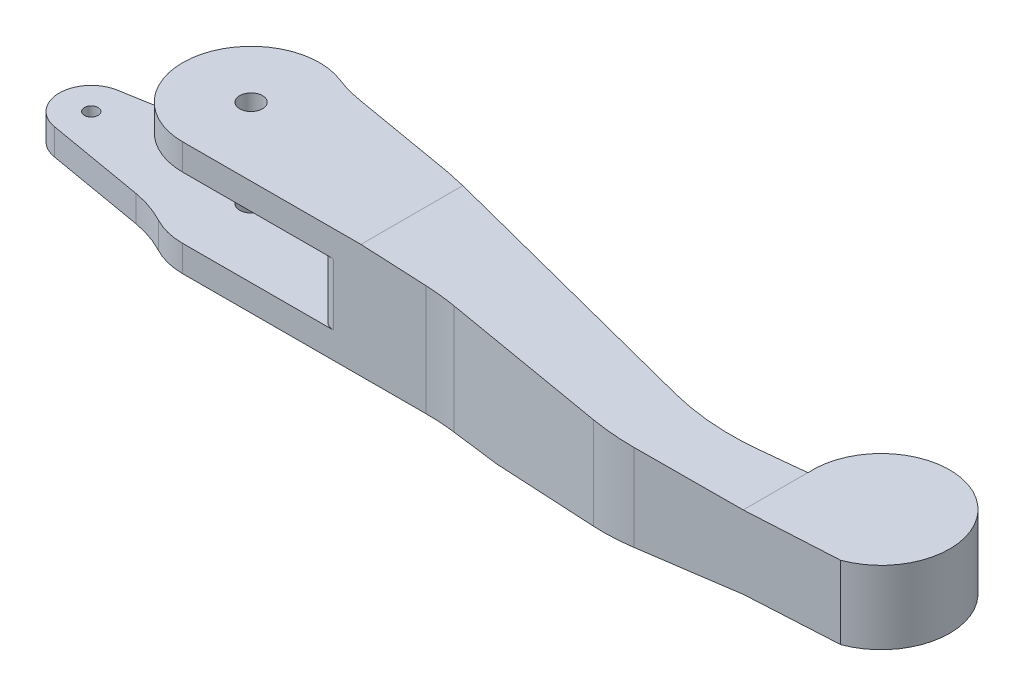
ISO-10303-21;
HEADER;
FILE_DESCRIPTION(('STEP AP214'),'2;1');
FILE_NAME('part.step','',(''),(''),'','','');
FILE_SCHEMA(('AUTOMOTIVE_DESIGN { 1 0 10303 214 1 1 1 1 }'));
ENDSEC;
DATA;
#1=APPLICATION_CONTEXT('core data for automotive mechanical design processes');
#2=APPLICATION_PROTOCOL_DEFINITION('international standard','automotive_design',2000,#1);
#3=PRODUCT_CONTEXT('',#1,'mechanical');
#4=PRODUCT('Part','Part','',(#3));
#5=PRODUCT_RELATED_PRODUCT_CATEGORY('part','',(#4));
#6=PRODUCT_DEFINITION_FORMATION('','',#4);
#7=PRODUCT_DEFINITION_CONTEXT('part definition',#1,'design');
#8=PRODUCT_DEFINITION('design','',#6,#7);
#9=PRODUCT_DEFINITION_SHAPE('','',#8);
#10=(LENGTH_UNIT() NAMED_UNIT(*) SI_UNIT(.MILLI.,.METRE.));
#11=(NAMED_UNIT(*) PLANE_ANGLE_UNIT() SI_UNIT($,.RADIAN.));
#12=(NAMED_UNIT(*) SI_UNIT($,.STERADIAN.) SOLID_ANGLE_UNIT());
#13=UNCERTAINTY_MEASURE_WITH_UNIT(LENGTH_MEASURE(1.E-05),#10,'distance_accuracy_value','');
#14=(GEOMETRIC_REPRESENTATION_CONTEXT(3) GLOBAL_UNCERTAINTY_ASSIGNED_CONTEXT((#13)) GLOBAL_UNIT_ASSIGNED_CONTEXT((#10,
#11,#12)) REPRESENTATION_CONTEXT('',''));
#15=CARTESIAN_POINT('',(0.,0.,0.));
#16=DIRECTION('',(0.,0.,1.));
#17=DIRECTION('',(1.,0.,0.));
#18=AXIS2_PLACEMENT_3D('',#15,#16,#17);
#19=CARTESIAN_POINT('',(0.,12.5,0.));
#20=DIRECTION('',(0.,-1.,0.));
#21=DIRECTION('',(0.,0.,-1.));
#22=AXIS2_PLACEMENT_3D('',#19,#20,#21);
#23=CYLINDRICAL_SURFACE('',#22,15.);
#24=CARTESIAN_POINT('',(0.,-12.5,0.));
#25=DIRECTION('',(0.,1.,0.));
#26=DIRECTION('',(0.,0.,1.));
#27=AXIS2_PLACEMENT_3D('',#24,#25,#26);
#28=CIRCLE('',#27,15.);
#29=CARTESIAN_POINT('',(5.47775067742488,-12.5,-13.9640340702811));
#30=VERTEX_POINT('',#29);
#31=CARTESIAN_POINT('',(-7.07384101472095,-12.5,-13.2272738422719));
#32=VERTEX_POINT('',#31);
#33=EDGE_CURVE('E395',#30,#32,#28,.T.);
#34=ORIENTED_EDGE('',*,*,#33,.T.);
#35=DIRECTION('',(0.,-1.,0.));
#36=VECTOR('',#35,1.);
#37=CARTESIAN_POINT('',(-7.07384101472095,12.5,-13.2272738422719));
#38=LINE('',#37,#36);
#39=CARTESIAN_POINT('',(-7.07384101472095,-6.75,-13.2272738422719));
#40=VERTEX_POINT('',#39);
#41=EDGE_CURVE('E53',#32,#40,#38,.F.);
#42=ORIENTED_EDGE('',*,*,#41,.T.);
#43=CARTESIAN_POINT('',(0.,-6.75,0.));
#44=DIRECTION('',(0.,1.,0.));
#45=DIRECTION('',(0.,0.,1.));
#46=AXIS2_PLACEMENT_3D('',#43,#44,#45);
#47=CIRCLE('',#46,15.);
#48=CARTESIAN_POINT('',(5.47775067742488,-6.75,-13.9640340702811));
#49=VERTEX_POINT('',#48);
#50=EDGE_CURVE('E287',#40,#49,#47,.F.);
#51=ORIENTED_EDGE('',*,*,#50,.T.);
#52=DIRECTION('',(0.,-1.,0.));
#53=VECTOR('',#52,1.);
#54=CARTESIAN_POINT('',(5.47775067742488,12.5,-13.9640340702811));
#55=LINE('',#54,#53);
#56=EDGE_CURVE('E443',#49,#30,#55,.T.);
#57=ORIENTED_EDGE('',*,*,#56,.T.);
#58=EDGE_LOOP('',(#34,#42,#51,#57));
#59=FACE_BOUND('',#58,.T.);
#60=ADVANCED_FACE('F32',(#59),#23,.T.);
#61=CARTESIAN_POINT('',(0.0257638334711041,-6.75,14.9999778741465));
#62=VERTEX_POINT('',#61);
#63=CARTESIAN_POINT('',(-7.07384101472095,-6.75,13.2272738422719));
#64=VERTEX_POINT('',#63);
#65=EDGE_CURVE('E288',#62,#64,#47,.F.);
#66=ORIENTED_EDGE('',*,*,#65,.T.);
#67=DIRECTION('',(0.,-1.,0.));
#68=VECTOR('',#67,1.);
#69=CARTESIAN_POINT('',(-7.07384101472095,12.5,13.2272738422719));
#70=LINE('',#69,#68);
#71=CARTESIAN_POINT('',(-7.07384101472095,-12.5,13.2272738422719));
#72=VERTEX_POINT('',#71);
#73=EDGE_CURVE('E476',#64,#72,#70,.T.);
#74=ORIENTED_EDGE('',*,*,#73,.T.);
#75=CARTESIAN_POINT('',(0.0257638334711041,-12.5,14.9999778741465));
#76=VERTEX_POINT('',#75);
#77=EDGE_CURVE('E378',#72,#76,#28,.T.);
#78=ORIENTED_EDGE('',*,*,#77,.T.);
#79=DIRECTION('',(0.,-1.,0.));
#80=VECTOR('',#79,1.);
#81=CARTESIAN_POINT('',(0.0257638334711041,12.5,14.9999778741465));
#82=LINE('',#81,#80);
#83=EDGE_CURVE('E439',#62,#76,#82,.T.);
#84=ORIENTED_EDGE('',*,*,#83,.F.);
#85=EDGE_LOOP('',(#66,#74,#78,#84));
#86=FACE_BOUND('',#85,.T.);
#87=ADVANCED_FACE('F491',(#86),#23,.T.);
#88=CARTESIAN_POINT('',(0.0257638334711041,12.5,14.9999778741465));
#89=DIRECTION('',(-0.00171758889807358,0.,-0.999998524943101));
#90=DIRECTION('',(-0.999998524943101,0.,0.00171758889807358));
#91=AXIS2_PLACEMENT_3D('',#88,#89,#90);
#92=PLANE('',#91);
#93=DIRECTION('',(0.,-1.,0.));
#94=VECTOR('',#93,1.);
#95=CARTESIAN_POINT('',(33.0051527666942,-6.74999999999999,14.9433327582948));
#96=LINE('',#95,#94);
#97=CARTESIAN_POINT('',(33.0051527666942,6.75,14.9433327582948));
#98=VERTEX_POINT('',#97);
#99=CARTESIAN_POINT('',(33.0051527666942,-6.75,14.9433327582948));
#100=VERTEX_POINT('',#99);
#101=EDGE_CURVE('E455',#98,#100,#96,.T.);
#102=ORIENTED_EDGE('',*,*,#101,.T.);
#103=DIRECTION('',(-0.999998524943101,0.,0.00171758889807358));
#104=VECTOR('',#103,1.);
#105=CARTESIAN_POINT('',(-15.0090155533778,-6.75,15.0258014823976));
#106=LINE('',#105,#104);
#107=EDGE_CURVE('E291',#100,#62,#106,.T.);
#108=ORIENTED_EDGE('',*,*,#107,.T.);
#109=ORIENTED_EDGE('',*,*,#83,.T.);
#110=DIRECTION('',(0.999998524943101,0.,-0.00171758889807358));
#111=VECTOR('',#110,1.);
#112=CARTESIAN_POINT('',(0.0257638334711041,-12.5,14.9999778741465));
#113=LINE('',#112,#111);
#114=CARTESIAN_POINT('',(53.1996973812149,-12.5,14.9086467814994));
#115=VERTEX_POINT('',#114);
#116=EDGE_CURVE('E397',#76,#115,#113,.T.);
#117=ORIENTED_EDGE('',*,*,#116,.T.);
#118=DIRECTION('',(0.,-1.,0.));
#119=VECTOR('',#118,1.);
#120=CARTESIAN_POINT('',(53.1996973812149,12.5,14.9086467814994));
#121=LINE('',#120,#119);
#122=CARTESIAN_POINT('',(53.1996973812149,11.7701491317501,14.9086467814994));
#123=VERTEX_POINT('',#122);
#124=EDGE_CURVE('E437',#123,#115,#121,.T.);
#125=ORIENTED_EDGE('',*,*,#124,.F.);
#126=DIRECTION('',(-0.998683737641599,0.0512625575935651,0.00171533063067012));
#127=VECTOR('',#126,1.);
#128=CARTESIAN_POINT('',(38.9717829891499,12.5004697061913,14.9330845253491));
#129=LINE('',#128,#127);
#130=CARTESIAN_POINT('',(38.9809336823027,12.5,14.9330688081969));
#131=VERTEX_POINT('',#130);
#132=EDGE_CURVE('E334',#123,#131,#129,.T.);
#133=ORIENTED_EDGE('',*,*,#132,.T.);
#134=DIRECTION('',(0.999998524943101,0.,-0.00171758889807358));
#135=VECTOR('',#134,1.);
#136=CARTESIAN_POINT('',(0.0257638334711041,12.5,14.9999778741465));
#137=LINE('',#136,#135);
#138=CARTESIAN_POINT('',(0.0257638334711041,12.5,14.9999778741465));
#139=VERTEX_POINT('',#138);
#140=EDGE_CURVE('E383',#139,#131,#137,.T.);
#141=ORIENTED_EDGE('',*,*,#140,.F.);
#142=CARTESIAN_POINT('',(0.0257638334711041,6.75,14.9999778741465));
#143=VERTEX_POINT('',#142);
#144=EDGE_CURVE('E440',#139,#143,#82,.T.);
#145=ORIENTED_EDGE('',*,*,#144,.T.);
#146=DIRECTION('',(0.999998524943101,0.,-0.00171758889807358));
#147=VECTOR('',#146,1.);
#148=CARTESIAN_POINT('',(-15.0090155533778,6.75,15.0258014823976));
#149=LINE('',#148,#147);
#150=EDGE_CURVE('E300',#143,#98,#149,.T.);
#151=ORIENTED_EDGE('',*,*,#150,.T.);
#152=EDGE_LOOP('',(#102,#108,#109,#117,#125,#133,#141,#145,#151));
#153=FACE_BOUND('',#152,.T.);
#154=ADVANCED_FACE('F500',(#153),#92,.F.);
#155=CARTESIAN_POINT('',(0.,6.75,0.));
#156=DIRECTION('',(0.,-1.,0.));
#157=DIRECTION('',(0.,0.,-1.));
#158=AXIS2_PLACEMENT_3D('',#155,#156,#157);
#159=CIRCLE('',#158,15.);
#160=CARTESIAN_POINT('',(5.47775067742488,6.75,-13.9640340702811));
#161=VERTEX_POINT('',#160);
#162=EDGE_CURVE('E284',#161,#143,#159,.F.);
#163=ORIENTED_EDGE('',*,*,#162,.T.);
#164=ORIENTED_EDGE('',*,*,#144,.F.);
#165=CARTESIAN_POINT('',(0.,12.5,0.));
#166=DIRECTION('',(0.,1.,0.));
#167=DIRECTION('',(0.,0.,1.));
#168=AXIS2_PLACEMENT_3D('',#165,#166,#167);
#169=CIRCLE('',#168,15.);
#170=CARTESIAN_POINT('',(5.47775067742488,12.5,-13.9640340702811));
#171=VERTEX_POINT('',#170);
#172=EDGE_CURVE('E381',#171,#139,#169,.T.);
#173=ORIENTED_EDGE('',*,*,#172,.F.);
#174=EDGE_CURVE('E444',#171,#161,#55,.T.);
#175=ORIENTED_EDGE('',*,*,#174,.T.);
#176=EDGE_LOOP('',(#163,#164,#173,#175));
#177=FACE_BOUND('',#176,.T.);
#178=ADVANCED_FACE('F549',(#177),#23,.T.);
#179=CARTESIAN_POINT('',(33.6184430498836,12.5,-8.48246372373337));
#180=DIRECTION('',(-0.170080496239836,0.,0.985430172462164));
#181=DIRECTION('',(0.985430172462165,0.,0.170080496239836));
#182=AXIS2_PLACEMENT_3D('',#179,#180,#181);
#183=PLANE('',#182);
#184=DIRECTION('',(-0.985430172462165,0.,-0.170080496239836));
#185=VECTOR('',#184,1.);
#186=CARTESIAN_POINT('',(-14.6861187243888,-6.75,-16.8195981720207));
#187=LINE('',#186,#185);
#188=CARTESIAN_POINT('',(33.5102414887195,-6.75,-8.50113879146621));
#189=VERTEX_POINT('',#188);
#190=CARTESIAN_POINT('',(11.3308371450796,-6.75,-12.3291970369784));
#191=VERTEX_POINT('',#190);
#192=EDGE_CURVE('E276',#189,#191,#187,.T.);
#193=ORIENTED_EDGE('',*,*,#192,.F.);
#194=DIRECTION('',(0.,-1.,0.));
#195=VECTOR('',#194,1.);
#196=CARTESIAN_POINT('',(33.5102414887195,6.75,-8.50113879146621));
#197=LINE('',#196,#195);
#198=CARTESIAN_POINT('',(33.5102414887195,6.75,-8.50113879146621));
#199=VERTEX_POINT('',#198);
#200=EDGE_CURVE('E463',#189,#199,#197,.F.);
#201=ORIENTED_EDGE('',*,*,#200,.T.);
#202=DIRECTION('',(0.985430172462165,0.,0.170080496239836));
#203=VECTOR('',#202,1.);
#204=CARTESIAN_POINT('',(-14.6861187243888,6.75,-16.8195981720207));
#205=LINE('',#204,#203);
#206=CARTESIAN_POINT('',(11.3308371450796,6.75,-12.3291970369784));
#207=VERTEX_POINT('',#206);
#208=EDGE_CURVE('E271',#207,#199,#205,.T.);
#209=ORIENTED_EDGE('',*,*,#208,.F.);
#210=DIRECTION('',(0.,1.,0.));
#211=VECTOR('',#210,1.);
#212=CARTESIAN_POINT('',(11.3308371450796,12.5,-12.3291970369784));
#213=LINE('',#212,#211);
#214=CARTESIAN_POINT('',(11.3308371450796,12.5,-12.3291970369784));
#215=VERTEX_POINT('',#214);
#216=EDGE_CURVE('E447',#207,#215,#213,.T.);
#217=ORIENTED_EDGE('',*,*,#216,.T.);
#218=DIRECTION('',(-0.985430172462165,0.,-0.170080496239836));
#219=VECTOR('',#218,1.);
#220=CARTESIAN_POINT('',(33.6184430498836,12.5,-8.48246372373337));
#221=LINE('',#220,#219);
#222=CARTESIAN_POINT('',(33.6184430498836,12.5,-8.48246372373337));
#223=VERTEX_POINT('',#222);
#224=EDGE_CURVE('E391',#223,#215,#221,.T.);
#225=ORIENTED_EDGE('',*,*,#224,.F.);
#226=DIRECTION('',(0.,-1.,0.));
#227=VECTOR('',#226,1.);
#228=CARTESIAN_POINT('',(33.6184430498836,12.5,-8.48246372373337));
#229=LINE('',#228,#227);
#230=CARTESIAN_POINT('',(33.6184430498836,-12.5,-8.48246372373337));
#231=VERTEX_POINT('',#230);
#232=EDGE_CURVE('E394',#223,#231,#229,.T.);
#233=ORIENTED_EDGE('',*,*,#232,.T.);
#234=DIRECTION('',(-0.985430172462165,0.,-0.170080496239836));
#235=VECTOR('',#234,1.);
#236=CARTESIAN_POINT('',(33.6184430498836,-12.5,-8.48246372373337));
#237=LINE('',#236,#235);
#238=CARTESIAN_POINT('',(11.3308371450796,-12.5,-12.3291970369784));
#239=VERTEX_POINT('',#238);
#240=EDGE_CURVE('E384',#231,#239,#237,.T.);
#241=ORIENTED_EDGE('',*,*,#240,.T.);
#242=EDGE_CURVE('E448',#239,#191,#213,.T.);
#243=ORIENTED_EDGE('',*,*,#242,.T.);
#244=EDGE_LOOP('',(#193,#201,#209,#217,#225,#233,#241,#243));
#245=FACE_BOUND('',#244,.T.);
#246=ADVANCED_FACE('F527',(#245),#183,.F.);
#247=CARTESIAN_POINT('',(0.,12.5,0.));
#248=DIRECTION('',(0.,-1.,0.));
#249=DIRECTION('',(0.,0.,-1.));
#250=AXIS2_PLACEMENT_3D('',#247,#248,#249);
#251=CYLINDRICAL_SURFACE('',#250,2.5);
#252=CARTESIAN_POINT('',(0.,-12.5,0.));
#253=DIRECTION('',(0.,1.,0.));
#254=DIRECTION('',(0.,0.,1.));
#255=AXIS2_PLACEMENT_3D('',#252,#253,#254);
#256=CIRCLE('',#255,2.5);
#257=CARTESIAN_POINT('',(0.,-12.5,2.5));
#258=VERTEX_POINT('',#257);
#259=EDGE_CURVE('E343',#258,#258,#256,.T.);
#260=ORIENTED_EDGE('',*,*,#259,.F.);
#261=EDGE_LOOP('',(#260));
#262=FACE_BOUND('',#261,.T.);
#263=CARTESIAN_POINT('',(0.,-6.75,0.));
#264=DIRECTION('',(0.,1.,0.));
#265=DIRECTION('',(0.,0.,1.));
#266=AXIS2_PLACEMENT_3D('',#263,#264,#265);
#267=CIRCLE('',#266,2.5);
#268=CARTESIAN_POINT('',(0.,-6.75,2.5));
#269=VERTEX_POINT('',#268);
#270=EDGE_CURVE('E281',#269,#269,#267,.F.);
#271=ORIENTED_EDGE('',*,*,#270,.F.);
#272=EDGE_LOOP('',(#271));
#273=FACE_BOUND('',#272,.T.);
#274=ADVANCED_FACE('F561',(#262,#273),#251,.F.);
#275=CARTESIAN_POINT('',(0.,12.5,0.));
#276=DIRECTION('',(0.,1.,0.));
#277=DIRECTION('',(0.,0.,1.));
#278=AXIS2_PLACEMENT_3D('',#275,#276,#277);
#279=CIRCLE('',#278,2.5);
#280=CARTESIAN_POINT('',(0.,12.5,2.5));
#281=VERTEX_POINT('',#280);
#282=EDGE_CURVE('E375',#281,#281,#279,.T.);
#283=ORIENTED_EDGE('',*,*,#282,.T.);
#284=EDGE_LOOP('',(#283));
#285=FACE_BOUND('',#284,.T.);
#286=CARTESIAN_POINT('',(0.,6.75,0.));
#287=DIRECTION('',(0.,-1.,0.));
#288=DIRECTION('',(0.,0.,-1.));
#289=AXIS2_PLACEMENT_3D('',#286,#287,#288);
#290=CIRCLE('',#289,2.5);
#291=CARTESIAN_POINT('',(0.,6.75,-2.5));
#292=VERTEX_POINT('',#291);
#293=EDGE_CURVE('E278',#292,#292,#290,.F.);
#294=ORIENTED_EDGE('',*,*,#293,.F.);
#295=EDGE_LOOP('',(#294));
#296=FACE_BOUND('',#295,.T.);
#297=ADVANCED_FACE('F629',(#285,#296),#251,.F.);
#298=CARTESIAN_POINT('',(16.4332520322747,12.5,-41.8921022108433));
#299=DIRECTION('',(0.,-1.,0.));
#300=DIRECTION('',(0.,0.,-1.));
#301=AXIS2_PLACEMENT_3D('',#298,#299,#300);
#302=CYLINDRICAL_SURFACE('',#301,30.);
#303=CARTESIAN_POINT('',(16.4332520322747,-6.75,-41.8921022108433));
#304=DIRECTION('',(0.,-1.,0.));
#305=DIRECTION('',(0.,0.,-1.));
#306=AXIS2_PLACEMENT_3D('',#303,#304,#305);
#307=CIRCLE('',#306,30.);
#308=EDGE_CURVE('E273',#191,#49,#307,.T.);
#309=ORIENTED_EDGE('',*,*,#308,.F.);
#310=ORIENTED_EDGE('',*,*,#242,.F.);
#311=CARTESIAN_POINT('',(16.4332520322747,-12.5,-41.8921022108433));
#312=DIRECTION('',(0.,1.,0.));
#313=DIRECTION('',(0.,0.,1.));
#314=AXIS2_PLACEMENT_3D('',#311,#312,#313);
#315=CIRCLE('',#314,30.);
#316=EDGE_CURVE('E451',#30,#239,#315,.T.);
#317=ORIENTED_EDGE('',*,*,#316,.F.);
#318=ORIENTED_EDGE('',*,*,#56,.F.);
#319=EDGE_LOOP('',(#309,#310,#317,#318));
#320=FACE_BOUND('',#319,.T.);
#321=ADVANCED_FACE('F525',(#320),#302,.F.);
#322=CARTESIAN_POINT('',(16.4332520322747,6.75,-41.8921022108433));
#323=DIRECTION('',(0.,1.,0.));
#324=DIRECTION('',(0.,0.,1.));
#325=AXIS2_PLACEMENT_3D('',#322,#323,#324);
#326=CIRCLE('',#325,30.);
#327=EDGE_CURVE('E268',#161,#207,#326,.T.);
#328=ORIENTED_EDGE('',*,*,#327,.F.);
#329=ORIENTED_EDGE('',*,*,#174,.F.);
#330=CARTESIAN_POINT('',(16.4332520322747,12.5,-41.8921022108433));
#331=DIRECTION('',(0.,1.,0.));
#332=DIRECTION('',(0.,0.,1.));
#333=AXIS2_PLACEMENT_3D('',#330,#331,#332);
#334=CIRCLE('',#333,30.);
#335=EDGE_CURVE('E453',#215,#171,#334,.F.);
#336=ORIENTED_EDGE('',*,*,#335,.F.);
#337=ORIENTED_EDGE('',*,*,#216,.F.);
#338=EDGE_LOOP('',(#328,#329,#336,#337));
#339=FACE_BOUND('',#338,.T.);
#340=ADVANCED_FACE('F573',(#339),#302,.F.);
#341=CARTESIAN_POINT('',(0.,12.5,0.));
#342=DIRECTION('',(0.,1.,0.));
#343=DIRECTION('',(0.,0.,1.));
#344=AXIS2_PLACEMENT_3D('',#341,#342,#343);
#345=PLANE('',#344);
#346=ORIENTED_EDGE('',*,*,#282,.F.);
#347=EDGE_LOOP('',(#346));
#348=FACE_BOUND('',#347,.T.);
#349=ORIENTED_EDGE('',*,*,#140,.T.);
#350=DIRECTION('',(0.,0.,-1.));
#351=VECTOR('',#350,1.);
#352=CARTESIAN_POINT('',(38.9809336823028,12.5,20.2747525494548));
#353=LINE('',#352,#351);
#354=CARTESIAN_POINT('',(38.9809336823028,12.5,-7.35654011009883));
#355=VERTEX_POINT('',#354);
#356=EDGE_CURVE('E337',#131,#355,#353,.T.);
#357=ORIENTED_EDGE('',*,*,#356,.T.);
#358=DIRECTION('',(-0.976678236186617,0.,-0.214708227507467));
#359=VECTOR('',#358,1.);
#360=CARTESIAN_POINT('',(98.604771495295,12.5,5.75087649826532));
#361=LINE('',#360,#359);
#362=CARTESIAN_POINT('',(35.8498296132655,12.5,-8.04486690995593));
#363=VERTEX_POINT('',#362);
#364=EDGE_CURVE('E387',#355,#363,#361,.T.);
#365=ORIENTED_EDGE('',*,*,#364,.T.);
#366=CARTESIAN_POINT('',(25.114418237892,12.5,40.7890448993749));
#367=DIRECTION('',(0.,1.,0.));
#368=DIRECTION('',(0.,0.,1.));
#369=AXIS2_PLACEMENT_3D('',#366,#367,#368);
#370=CIRCLE('',#369,50.);
#371=EDGE_CURVE('E389',#363,#223,#370,.T.);
#372=ORIENTED_EDGE('',*,*,#371,.T.);
#373=ORIENTED_EDGE('',*,*,#224,.T.);
#374=ORIENTED_EDGE('',*,*,#335,.T.);
#375=ORIENTED_EDGE('',*,*,#172,.T.);
#376=EDGE_LOOP('',(#349,#357,#365,#372,#373,#374,#375));
#377=FACE_BOUND('',#376,.T.);
#378=ADVANCED_FACE('F569',(#348,#377),#345,.T.);
#379=CARTESIAN_POINT('',(0.,-12.5,0.));
#380=DIRECTION('',(0.,1.,0.));
#381=DIRECTION('',(0.,0.,1.));
#382=AXIS2_PLACEMENT_3D('',#379,#380,#381);
#383=PLANE('',#382);
#384=ORIENTED_EDGE('',*,*,#259,.T.);
#385=EDGE_LOOP('',(#384));
#386=FACE_BOUND('',#385,.T.);
#387=DIRECTION('',(0.,0.,1.));
#388=VECTOR('',#387,1.);
#389=CARTESIAN_POINT('',(70.2908704244543,-12.5,20.2747525494548));
#390=LINE('',#389,#388);
#391=CARTESIAN_POINT('',(70.2908704244541,-12.5,-0.473514798174354));
#392=VERTEX_POINT('',#391);
#393=CARTESIAN_POINT('',(70.2908704244541,-12.5,16.6908594045449));
#394=VERTEX_POINT('',#393);
#395=EDGE_CURVE('E349',#392,#394,#390,.T.);
#396=ORIENTED_EDGE('',*,*,#395,.T.);
#397=DIRECTION('',(0.991747325104625,0.,0.12820781235097));
#398=VECTOR('',#397,1.);
#399=CARTESIAN_POINT('',(59.6959674436675,-12.5,15.3212067734233));
#400=LINE('',#399,#398);
#401=CARTESIAN_POINT('',(59.6959674436675,-12.5,15.3212067734233));
#402=VERTEX_POINT('',#401);
#403=EDGE_CURVE('E403',#402,#394,#400,.T.);
#404=ORIENTED_EDGE('',*,*,#403,.F.);
#405=CARTESIAN_POINT('',(53.2855768261188,-12.5,64.9085730286545));
#406=DIRECTION('',(0.,-1.,0.));
#407=DIRECTION('',(0.,0.,-1.));
#408=AXIS2_PLACEMENT_3D('',#405,#406,#407);
#409=CIRCLE('',#408,50.);
#410=EDGE_CURVE('E400',#115,#402,#409,.T.);
#411=ORIENTED_EDGE('',*,*,#410,.F.);
#412=ORIENTED_EDGE('',*,*,#116,.F.);
#413=ORIENTED_EDGE('',*,*,#77,.F.);
#414=CARTESIAN_POINT('',(-18.8635760392559,-12.5,35.2727302460585));
#415=DIRECTION('',(0.,1.,0.));
#416=DIRECTION('',(0.,0.,1.));
#417=AXIS2_PLACEMENT_3D('',#414,#415,#416);
#418=CIRCLE('',#417,25.);
#419=CARTESIAN_POINT('',(-14.5954618987489,-12.5,10.6397604355869));
#420=VERTEX_POINT('',#419);
#421=EDGE_CURVE('E484',#72,#420,#418,.T.);
#422=ORIENTED_EDGE('',*,*,#421,.T.);
#423=DIRECTION('',(0.985318792418863,0.,0.170724565620279));
#424=VECTOR('',#423,1.);
#425=CARTESIAN_POINT('',(-2.21521266506011,-12.5,12.7848658460943));
#426=LINE('',#425,#424);
#427=CARTESIAN_POINT('',(-36.1950719593419,-12.5,6.89723154693204));
#428=VERTEX_POINT('',#427);
#429=EDGE_CURVE('E263',#428,#420,#426,.T.);
#430=ORIENTED_EDGE('',*,*,#429,.F.);
#431=CARTESIAN_POINT('',(-35.,-12.5,0.));
#432=DIRECTION('',(0.,1.,0.));
#433=DIRECTION('',(0.,0.,1.));
#434=AXIS2_PLACEMENT_3D('',#431,#432,#433);
#435=CIRCLE('',#434,7.);
#436=CARTESIAN_POINT('',(-36.1950719593419,-12.5,-6.89723154693204));
#437=VERTEX_POINT('',#436);
#438=EDGE_CURVE('E235',#437,#428,#435,.T.);
#439=ORIENTED_EDGE('',*,*,#438,.F.);
#440=DIRECTION('',(-0.985318792418863,0.,0.170724565620279));
#441=VECTOR('',#440,1.);
#442=CARTESIAN_POINT('',(-2.21521266506011,-12.5,-12.7848658460943));
#443=LINE('',#442,#441);
#444=CARTESIAN_POINT('',(-14.5954618987489,-12.5,-10.6397604355869));
#445=VERTEX_POINT('',#444);
#446=EDGE_CURVE('E265',#445,#437,#443,.T.);
#447=ORIENTED_EDGE('',*,*,#446,.F.);
#448=CARTESIAN_POINT('',(-18.8635760392559,-12.5,-35.2727302460585));
#449=DIRECTION('',(0.,1.,0.));
#450=DIRECTION('',(0.,0.,1.));
#451=AXIS2_PLACEMENT_3D('',#448,#449,#450);
#452=CIRCLE('',#451,25.);
#453=EDGE_CURVE('E40',#445,#32,#452,.T.);
#454=ORIENTED_EDGE('',*,*,#453,.T.);
#455=ORIENTED_EDGE('',*,*,#33,.F.);
#456=ORIENTED_EDGE('',*,*,#316,.T.);
#457=ORIENTED_EDGE('',*,*,#240,.F.);
#458=CARTESIAN_POINT('',(25.114418237892,-12.5,40.7890448993749));
#459=DIRECTION('',(0.,1.,0.));
#460=DIRECTION('',(0.,0.,1.));
#461=AXIS2_PLACEMENT_3D('',#458,#459,#460);
#462=CIRCLE('',#461,50.);
#463=CARTESIAN_POINT('',(35.8498296132655,-12.5,-8.04486690995593));
#464=VERTEX_POINT('',#463);
#465=EDGE_CURVE('E408',#464,#231,#462,.T.);
#466=ORIENTED_EDGE('',*,*,#465,.F.);
#467=DIRECTION('',(-0.976678236186617,0.,-0.214708227507467));
#468=VECTOR('',#467,1.);
#469=CARTESIAN_POINT('',(98.604771495295,-12.5,5.75087649826532));
#470=LINE('',#469,#468);
#471=EDGE_CURVE('E406',#392,#464,#470,.T.);
#472=ORIENTED_EDGE('',*,*,#471,.F.);
#473=EDGE_LOOP('',(#396,#404,#411,#412,#413,#422,#430,#439,#447,#454,#455,#456,#457,#466,#472));
#474=FACE_BOUND('',#473,.T.);
#475=CARTESIAN_POINT('',(-35.,-12.5,0.));
#476=DIRECTION('',(0.,1.,0.));
#477=DIRECTION('',(0.,0.,1.));
#478=AXIS2_PLACEMENT_3D('',#475,#476,#477);
#479=CIRCLE('',#478,1.5);
#480=CARTESIAN_POINT('',(-35.,-12.5,1.5));
#481=VERTEX_POINT('',#480);
#482=EDGE_CURVE('E248',#481,#481,#479,.T.);
#483=ORIENTED_EDGE('',*,*,#482,.T.);
#484=EDGE_LOOP('',(#483));
#485=FACE_BOUND('',#484,.T.);
#486=ADVANCED_FACE('F495',(#386,#474,#485),#383,.F.);
#487=CARTESIAN_POINT('',(53.2855768261188,12.5,64.9085730286545));
#488=DIRECTION('',(0.,-1.,0.));
#489=DIRECTION('',(0.,0.,-1.));
#490=AXIS2_PLACEMENT_3D('',#487,#488,#489);
#491=CYLINDRICAL_SURFACE('',#490,50.);
#492=CARTESIAN_POINT('',(53.2855768261188,11.7657409294088,64.9085730286545));
#493=DIRECTION('',(0.0512626330101598,0.998685206887969,0.));
#494=DIRECTION('',(0.998685206887969,-0.0512626330101598,0.));
#495=AXIS2_PLACEMENT_3D('',#492,#493,#494);
#496=ELLIPSE('',#495,50.0658262034404,50.);
#497=CARTESIAN_POINT('',(59.6959674436675,11.4366948001453,15.3212067734233));
#498=VERTEX_POINT('',#497);
#499=EDGE_CURVE('E331',#498,#123,#496,.T.);
#500=ORIENTED_EDGE('',*,*,#499,.T.);
#501=ORIENTED_EDGE('',*,*,#124,.T.);
#502=ORIENTED_EDGE('',*,*,#410,.T.);
#503=DIRECTION('',(0.,-1.,0.));
#504=VECTOR('',#503,1.);
#505=CARTESIAN_POINT('',(59.6959674436675,12.5,15.3212067734233));
#506=LINE('',#505,#504);
#507=EDGE_CURVE('E435',#498,#402,#506,.T.);
#508=ORIENTED_EDGE('',*,*,#507,.F.);
#509=EDGE_LOOP('',(#500,#501,#502,#508));
#510=FACE_BOUND('',#509,.T.);
#511=ADVANCED_FACE('F588',(#510),#491,.F.);
#512=CARTESIAN_POINT('',(59.6959674436675,12.5,15.3212067734233));
#513=DIRECTION('',(0.12820781235097,0.,-0.991747325104625));
#514=DIRECTION('',(-0.991747325104625,0.,-0.12820781235097));
#515=AXIS2_PLACEMENT_3D('',#512,#513,#514);
#516=PLANE('',#515);
#517=DIRECTION('',(-0.990464774214636,0.0508406772022522,-0.12804201100251));
#518=VECTOR('',#517,1.);
#519=CARTESIAN_POINT('',(39.9487657501334,12.4503210623663,12.7683937079438));
#520=LINE('',#519,#518);
#521=CARTESIAN_POINT('',(94.8143079773131,9.63406611366269,19.861118804686));
#522=VERTEX_POINT('',#521);
#523=EDGE_CURVE('E328',#522,#498,#520,.T.);
#524=ORIENTED_EDGE('',*,*,#523,.T.);
#525=ORIENTED_EDGE('',*,*,#507,.T.);
#526=ORIENTED_EDGE('',*,*,#403,.T.);
#527=DIRECTION('',(0.98865238608839,0.0789407843770409,0.127807715117949));
#528=VECTOR('',#527,1.);
#529=CARTESIAN_POINT('',(39.9452270427559,-14.9230042072271,12.7679362427005));
#530=LINE('',#529,#528);
#531=CARTESIAN_POINT('',(94.8143079773131,-10.5418806212531,19.861118804686));
#532=VERTEX_POINT('',#531);
#533=EDGE_CURVE('E307',#394,#532,#530,.T.);
#534=ORIENTED_EDGE('',*,*,#533,.T.);
#535=DIRECTION('',(0.,-1.,0.));
#536=VECTOR('',#535,1.);
#537=CARTESIAN_POINT('',(94.8143079773131,12.5,19.861118804686));
#538=LINE('',#537,#536);
#539=EDGE_CURVE('E432',#522,#532,#538,.T.);
#540=ORIENTED_EDGE('',*,*,#539,.F.);
#541=EDGE_LOOP('',(#524,#525,#526,#534,#540));
#542=FACE_BOUND('',#541,.T.);
#543=ADVANCED_FACE('F584',(#542),#516,.F.);
#544=CARTESIAN_POINT('',(101.224698594862,12.5,-29.7262474505452));
#545=DIRECTION('',(0.,-1.,0.));
#546=DIRECTION('',(0.,0.,-1.));
#547=AXIS2_PLACEMENT_3D('',#544,#545,#546);
#548=CYLINDRICAL_SURFACE('',#547,50.);
#549=CARTESIAN_POINT('',(101.224698594862,9.30501998439922,-29.7262474505452));
#550=DIRECTION('',(0.0512626330101598,0.998685206887969,0.));
#551=DIRECTION('',(0.998685206887969,-0.0512626330101598,0.));
#552=AXIS2_PLACEMENT_3D('',#549,#550,#551);
#553=ELLIPSE('',#552,50.0658262034404,50.);
#554=CARTESIAN_POINT('',(104.015710948823,9.16175698116145,20.1957942749295));
#555=VERTEX_POINT('',#554);
#556=EDGE_CURVE('E325',#555,#522,#553,.F.);
#557=ORIENTED_EDGE('',*,*,#556,.T.);
#558=ORIENTED_EDGE('',*,*,#539,.T.);
#559=CARTESIAN_POINT('',(101.224698594862,-10.0300310868432,-29.7262474505452));
#560=DIRECTION('',(0.0795935336932592,-0.996827402008101,0.));
#561=DIRECTION('',(-0.996827402008101,-0.0795935336932592,0.));
#562=AXIS2_PLACEMENT_3D('',#559,#560,#561);
#563=ELLIPSE('',#562,50.1591347702475,50.);
#564=CARTESIAN_POINT('',(104.015710948823,-9.80717752625115,20.1957942749295));
#565=VERTEX_POINT('',#564);
#566=EDGE_CURVE('E370',#532,#565,#563,.F.);
#567=ORIENTED_EDGE('',*,*,#566,.T.);
#568=DIRECTION('',(0.,-1.,0.));
#569=VECTOR('',#568,1.);
#570=CARTESIAN_POINT('',(104.015710948823,12.5,20.1957942749295));
#571=LINE('',#570,#569);
#572=EDGE_CURVE('E429',#555,#565,#571,.T.);
#573=ORIENTED_EDGE('',*,*,#572,.F.);
#574=EDGE_LOOP('',(#557,#558,#567,#573));
#575=FACE_BOUND('',#574,.T.);
#576=ADVANCED_FACE('F609',(#575),#548,.T.);
#577=CARTESIAN_POINT('',(104.015710948823,12.5,20.1957942749295));
#578=DIRECTION('',(-0.0558202470792113,0.,-0.998440834509494));
#579=DIRECTION('',(-0.998440834509495,0.,0.0558202470792113));
#580=AXIS2_PLACEMENT_3D('',#577,#578,#579);
#581=PLANE('',#580);
#582=DIRECTION('',(-0.997132173715423,0.0511829156287189,0.0557470832358036));
#583=VECTOR('',#582,1.);
#584=CARTESIAN_POINT('',(39.1786556145054,12.4898509091967,23.8206664992592));
#585=LINE('',#584,#583);
#586=CARTESIAN_POINT('',(126.648756560327,8.,18.930439178741));
#587=VERTEX_POINT('',#586);
#588=EDGE_CURVE('E322',#587,#555,#585,.T.);
#589=ORIENTED_EDGE('',*,*,#588,.T.);
#590=ORIENTED_EDGE('',*,*,#572,.T.);
#591=DIRECTION('',(0.995283006432192,0.0794702185626165,-0.0556437010712595));
#592=VECTOR('',#591,1.);
#593=CARTESIAN_POINT('',(39.1779229495319,-14.9842710264116,23.8207074606647));
#594=LINE('',#593,#592);
#595=CARTESIAN_POINT('',(126.648756560327,-8.,18.930439178741));
#596=VERTEX_POINT('',#595);
#597=EDGE_CURVE('E367',#565,#596,#594,.T.);
#598=ORIENTED_EDGE('',*,*,#597,.T.);
#599=DIRECTION('',(0.998440834509495,0.,-0.0558202470792113));
#600=VECTOR('',#599,1.);
#601=CARTESIAN_POINT('',(126.573833655451,-8.,18.9346279247513));
#602=LINE('',#601,#600);
#603=CARTESIAN_POINT('',(146.859436035156,-8.,17.8005123138428));
#604=VERTEX_POINT('',#603);
#605=EDGE_CURVE('E355',#596,#604,#602,.T.);
#606=ORIENTED_EDGE('',*,*,#605,.T.);
#607=DIRECTION('',(0.,-1.,0.));
#608=VECTOR('',#607,1.);
#609=CARTESIAN_POINT('',(146.859436035156,12.5,17.8005123138428));
#610=LINE('',#609,#608);
#611=CARTESIAN_POINT('',(146.859436035156,8.,17.8005123138428));
#612=VERTEX_POINT('',#611);
#613=EDGE_CURVE('E426',#612,#604,#610,.T.);
#614=ORIENTED_EDGE('',*,*,#613,.F.);
#615=DIRECTION('',(-0.998440834509495,0.,0.0558202470792113));
#616=VECTOR('',#615,1.);
#617=CARTESIAN_POINT('',(126.573833655451,8.,18.9346279247513));
#618=LINE('',#617,#616);
#619=EDGE_CURVE('E319',#612,#587,#618,.T.);
#620=ORIENTED_EDGE('',*,*,#619,.T.);
#621=EDGE_LOOP('',(#589,#590,#598,#606,#614,#620));
#622=FACE_BOUND('',#621,.T.);
#623=ADVANCED_FACE('F606',(#622),#581,.F.);
#624=CARTESIAN_POINT('',(141.648756560327,12.5,3.73463802851684));
#625=DIRECTION('',(0.,-1.,0.));
#626=DIRECTION('',(0.,0.,-1.));
#627=AXIS2_PLACEMENT_3D('',#624,#625,#626);
#628=CYLINDRICAL_SURFACE('',#627,15.);
#629=CARTESIAN_POINT('',(141.648756560327,8.,3.73463802851684));
#630=DIRECTION('',(0.,1.,0.));
#631=DIRECTION('',(0.,0.,1.));
#632=AXIS2_PLACEMENT_3D('',#629,#630,#631);
#633=CIRCLE('',#632,15.);
#634=CARTESIAN_POINT('',(126.685409545898,8.,4.78261041641235));
#635=VERTEX_POINT('',#634);
#636=EDGE_CURVE('E306',#635,#612,#633,.F.);
#637=ORIENTED_EDGE('',*,*,#636,.T.);
#638=ORIENTED_EDGE('',*,*,#613,.T.);
#639=CARTESIAN_POINT('',(141.648756560327,-8.,3.73463802851684));
#640=DIRECTION('',(0.,-1.,0.));
#641=DIRECTION('',(0.,0.,-1.));
#642=AXIS2_PLACEMENT_3D('',#639,#640,#641);
#643=CIRCLE('',#642,15.);
#644=CARTESIAN_POINT('',(126.685409545898,-8.,4.78261041641235));
#645=VERTEX_POINT('',#644);
#646=EDGE_CURVE('E346',#604,#645,#643,.F.);
#647=ORIENTED_EDGE('',*,*,#646,.T.);
#648=DIRECTION('',(0.,-1.,0.));
#649=VECTOR('',#648,1.);
#650=CARTESIAN_POINT('',(126.685409545898,12.5,4.78261041641235));
#651=LINE('',#650,#649);
#652=EDGE_CURVE('E423',#635,#645,#651,.T.);
#653=ORIENTED_EDGE('',*,*,#652,.F.);
#654=EDGE_LOOP('',(#637,#638,#647,#653));
#655=FACE_BOUND('',#654,.T.);
#656=ADVANCED_FACE('F603',(#655),#628,.T.);
#657=CARTESIAN_POINT('',(126.685409545898,12.5,4.78261041641235));
#658=DIRECTION('',(0.157488962447357,0.,0.987520747481923));
#659=DIRECTION('',(0.987520747481923,0.,-0.157488962447357));
#660=AXIS2_PLACEMENT_3D('',#657,#658,#659);
#661=PLANE('',#660);
#662=DIRECTION('',(0.986254503653287,-0.0506245635027888,-0.157287022966809));
#663=VECTOR('',#662,1.);
#664=CARTESIAN_POINT('',(38.7474538305872,12.5119845491564,18.806880226095));
#665=LINE('',#664,#663);
#666=CARTESIAN_POINT('',(117.214630993037,8.48425481161856,6.29300206303059));
#667=VERTEX_POINT('',#666);
#668=CARTESIAN_POINT('',(126.648756560327,8.,4.78845580313761));
#669=VERTEX_POINT('',#668);
#670=EDGE_CURVE('E316',#667,#669,#665,.T.);
#671=ORIENTED_EDGE('',*,*,#670,.T.);
#672=DIRECTION('',(0.987520747481923,0.,-0.157488962447357));
#673=VECTOR('',#672,1.);
#674=CARTESIAN_POINT('',(124.240271662216,8.,5.17255891048069));
#675=LINE('',#674,#673);
#676=EDGE_CURVE('E313',#669,#635,#675,.T.);
#677=ORIENTED_EDGE('',*,*,#676,.T.);
#678=ORIENTED_EDGE('',*,*,#652,.T.);
#679=DIRECTION('',(-0.987520747481923,0.,0.157488962447357));
#680=VECTOR('',#679,1.);
#681=CARTESIAN_POINT('',(124.240271662216,-8.,5.17255891048069));
#682=LINE('',#681,#680);
#683=CARTESIAN_POINT('',(126.648756560327,-8.,4.78845580313761));
#684=VERTEX_POINT('',#683);
#685=EDGE_CURVE('E352',#645,#684,#682,.T.);
#686=ORIENTED_EDGE('',*,*,#685,.T.);
#687=DIRECTION('',(-0.984465088092982,-0.078606441798366,0.157001648506882));
#688=VECTOR('',#687,1.);
#689=CARTESIAN_POINT('',(38.7483002925627,-15.0185750446939,18.8067452330646));
#690=LINE('',#689,#688);
#691=CARTESIAN_POINT('',(117.214630993037,-8.75328526251776,6.29300206303059));
#692=VERTEX_POINT('',#691);
#693=EDGE_CURVE('E364',#684,#692,#690,.T.);
#694=ORIENTED_EDGE('',*,*,#693,.T.);
#695=DIRECTION('',(0.,-1.,0.));
#696=VECTOR('',#695,1.);
#697=CARTESIAN_POINT('',(117.214630993037,12.5,6.29300206303059));
#698=LINE('',#697,#696);
#699=EDGE_CURVE('E420',#667,#692,#698,.T.);
#700=ORIENTED_EDGE('',*,*,#699,.F.);
#701=EDGE_LOOP('',(#671,#677,#678,#686,#694,#700));
#702=FACE_BOUND('',#701,.T.);
#703=ADVANCED_FACE('F598',(#702),#661,.F.);
#704=CARTESIAN_POINT('',(109.340182870669,12.5,-43.0830353110655));
#705=DIRECTION('',(0.,-1.,0.));
#706=DIRECTION('',(0.,0.,-1.));
#707=AXIS2_PLACEMENT_3D('',#704,#705,#706);
#708=CYLINDRICAL_SURFACE('',#707,50.);
#709=CARTESIAN_POINT('',(109.340182870669,8.8884511904879,-43.0830353110655));
#710=DIRECTION('',(0.0512626330101598,0.998685206887969,0.));
#711=DIRECTION('',(0.998685206887969,-0.0512626330101598,0.));
#712=AXIS2_PLACEMENT_3D('',#709,#710,#711);
#713=ELLIPSE('',#712,50.0658262034404,50.);
#714=CARTESIAN_POINT('',(98.604771495295,9.43950116074203,5.75087649826532));
#715=VERTEX_POINT('',#714);
#716=EDGE_CURVE('E310',#715,#667,#713,.T.);
#717=ORIENTED_EDGE('',*,*,#716,.T.);
#718=ORIENTED_EDGE('',*,*,#699,.T.);
#719=CARTESIAN_POINT('',(109.340182870669,-9.3820351852034,-43.0830353110655));
#720=DIRECTION('',(0.0795935336932592,-0.996827402008101,0.));
#721=DIRECTION('',(-0.996827402008101,-0.0795935336932592,0.));
#722=AXIS2_PLACEMENT_3D('',#719,#720,#721);
#723=ELLIPSE('',#722,50.1591347702475,50.);
#724=CARTESIAN_POINT('',(98.604771495295,-10.239224027821,5.75087649826532));
#725=VERTEX_POINT('',#724);
#726=EDGE_CURVE('E361',#692,#725,#723,.T.);
#727=ORIENTED_EDGE('',*,*,#726,.T.);
#728=DIRECTION('',(0.,-1.,0.));
#729=VECTOR('',#728,1.);
#730=CARTESIAN_POINT('',(98.604771495295,12.5,5.75087649826532));
#731=LINE('',#730,#729);
#732=EDGE_CURVE('E417',#715,#725,#731,.T.);
#733=ORIENTED_EDGE('',*,*,#732,.F.);
#734=EDGE_LOOP('',(#717,#718,#727,#733));
#735=FACE_BOUND('',#734,.T.);
#736=ADVANCED_FACE('F593',(#735),#708,.F.);
#737=CARTESIAN_POINT('',(98.604771495295,12.5,5.75087649826532));
#738=DIRECTION('',(-0.214708227507467,0.,0.976678236186617));
#739=DIRECTION('',(0.976678236186617,0.,0.214708227507467));
#740=AXIS2_PLACEMENT_3D('',#737,#738,#739);
#741=PLANE('',#740);
#742=DIRECTION('',(0.975453192939619,-0.0500701309114932,0.214438919915225));
#743=VECTOR('',#742,1.);
#744=CARTESIAN_POINT('',(44.760712892168,12.2033232309124,-6.08594135653191));
#745=LINE('',#744,#743);
#746=EDGE_CURVE('E303',#355,#715,#745,.T.);
#747=ORIENTED_EDGE('',*,*,#746,.T.);
#748=ORIENTED_EDGE('',*,*,#732,.T.);
#749=DIRECTION('',(-0.973721825491963,-0.0777486260600675,-0.21405830445552));
#750=VECTOR('',#749,1.);
#751=CARTESIAN_POINT('',(44.7402136189564,-14.540139606151,-6.09044781777305));
#752=LINE('',#751,#750);
#753=EDGE_CURVE('E302',#725,#392,#752,.T.);
#754=ORIENTED_EDGE('',*,*,#753,.T.);
#755=ORIENTED_EDGE('',*,*,#471,.T.);
#756=DIRECTION('',(0.,-1.,0.));
#757=VECTOR('',#756,1.);
#758=CARTESIAN_POINT('',(35.8498296132655,12.5,-8.04486690995593));
#759=LINE('',#758,#757);
#760=EDGE_CURVE('E414',#363,#464,#759,.T.);
#761=ORIENTED_EDGE('',*,*,#760,.F.);
#762=ORIENTED_EDGE('',*,*,#364,.F.);
#763=EDGE_LOOP('',(#747,#748,#754,#755,#761,#762));
#764=FACE_BOUND('',#763,.T.);
#765=ADVANCED_FACE('F580',(#764),#741,.F.);
#766=CARTESIAN_POINT('',(25.114418237892,12.5,40.7890448993749));
#767=DIRECTION('',(0.,-1.,0.));
#768=DIRECTION('',(0.,0.,-1.));
#769=AXIS2_PLACEMENT_3D('',#766,#767,#768);
#770=CYLINDRICAL_SURFACE('',#769,50.);
#771=ORIENTED_EDGE('',*,*,#465,.T.);
#772=ORIENTED_EDGE('',*,*,#232,.F.);
#773=ORIENTED_EDGE('',*,*,#371,.F.);
#774=ORIENTED_EDGE('',*,*,#760,.T.);
#775=EDGE_LOOP('',(#771,#772,#773,#774));
#776=FACE_BOUND('',#775,.T.);
#777=ADVANCED_FACE('F578',(#776),#770,.T.);
#778=CARTESIAN_POINT('',(126.648756560327,-8.,20.2747525494548));
#779=DIRECTION('',(0.,-1.,0.));
#780=DIRECTION('',(0.,0.,-1.));
#781=AXIS2_PLACEMENT_3D('',#778,#779,#780);
#782=PLANE('',#781);
#783=DIRECTION('',(0.,0.,-1.));
#784=VECTOR('',#783,1.);
#785=CARTESIAN_POINT('',(126.648756560327,-8.,20.2747525494548));
#786=LINE('',#785,#784);
#787=EDGE_CURVE('E358',#596,#684,#786,.T.);
#788=ORIENTED_EDGE('',*,*,#787,.T.);
#789=ORIENTED_EDGE('',*,*,#685,.F.);
#790=ORIENTED_EDGE('',*,*,#646,.F.);
#791=ORIENTED_EDGE('',*,*,#605,.F.);
#792=EDGE_LOOP('',(#788,#789,#790,#791));
#793=FACE_BOUND('',#792,.T.);
#794=ADVANCED_FACE('F601',(#793),#782,.T.);
#795=CARTESIAN_POINT('',(38.9809336823028,-15.,20.2747525494548));
#796=DIRECTION('',(0.0795935336932592,-0.996827402008101,0.));
#797=DIRECTION('',(0.996827402008101,0.0795935336932592,0.));
#798=AXIS2_PLACEMENT_3D('',#795,#796,#797);
#799=PLANE('',#798);
#800=ORIENTED_EDGE('',*,*,#753,.F.);
#801=ORIENTED_EDGE('',*,*,#726,.F.);
#802=ORIENTED_EDGE('',*,*,#693,.F.);
#803=ORIENTED_EDGE('',*,*,#787,.F.);
#804=ORIENTED_EDGE('',*,*,#597,.F.);
#805=ORIENTED_EDGE('',*,*,#566,.F.);
#806=ORIENTED_EDGE('',*,*,#533,.F.);
#807=ORIENTED_EDGE('',*,*,#395,.F.);
#808=EDGE_LOOP('',(#800,#801,#802,#803,#804,#805,#806,#807));
#809=FACE_BOUND('',#808,.T.);
#810=ADVANCED_FACE('F595',(#809),#799,.T.);
#811=CARTESIAN_POINT('',(38.9809336823028,12.5,20.2747525494548));
#812=DIRECTION('',(0.0512626330101598,0.998685206887969,0.));
#813=DIRECTION('',(-0.998685206887969,0.0512626330101598,0.));
#814=AXIS2_PLACEMENT_3D('',#811,#812,#813);
#815=PLANE('',#814);
#816=ORIENTED_EDGE('',*,*,#499,.F.);
#817=ORIENTED_EDGE('',*,*,#523,.F.);
#818=ORIENTED_EDGE('',*,*,#556,.F.);
#819=ORIENTED_EDGE('',*,*,#588,.F.);
#820=DIRECTION('',(0.,0.,-1.));
#821=VECTOR('',#820,1.);
#822=CARTESIAN_POINT('',(126.648756560327,8.,20.2747525494548));
#823=LINE('',#822,#821);
#824=EDGE_CURVE('E340',#587,#669,#823,.T.);
#825=ORIENTED_EDGE('',*,*,#824,.T.);
#826=ORIENTED_EDGE('',*,*,#670,.F.);
#827=ORIENTED_EDGE('',*,*,#716,.F.);
#828=ORIENTED_EDGE('',*,*,#746,.F.);
#829=ORIENTED_EDGE('',*,*,#356,.F.);
#830=ORIENTED_EDGE('',*,*,#132,.F.);
#831=EDGE_LOOP('',(#816,#817,#818,#819,#825,#826,#827,#828,#829,#830));
#832=FACE_BOUND('',#831,.T.);
#833=ADVANCED_FACE('F590',(#832),#815,.T.);
#834=CARTESIAN_POINT('',(126.648756560327,8.,20.2747525494548));
#835=DIRECTION('',(0.,1.,0.));
#836=DIRECTION('',(0.,0.,1.));
#837=AXIS2_PLACEMENT_3D('',#834,#835,#836);
#838=PLANE('',#837);
#839=ORIENTED_EDGE('',*,*,#636,.F.);
#840=ORIENTED_EDGE('',*,*,#676,.F.);
#841=ORIENTED_EDGE('',*,*,#824,.F.);
#842=ORIENTED_EDGE('',*,*,#619,.F.);
#843=EDGE_LOOP('',(#839,#840,#841,#842));
#844=FACE_BOUND('',#843,.T.);
#845=ADVANCED_FACE('F612',(#844),#838,.T.);
#846=CARTESIAN_POINT('',(-15.,-6.75,20.2747525494548));
#847=DIRECTION('',(0.,1.,0.));
#848=DIRECTION('',(0.,0.,1.));
#849=AXIS2_PLACEMENT_3D('',#846,#847,#848);
#850=PLANE('',#849);
#851=ORIENTED_EDGE('',*,*,#192,.T.);
#852=ORIENTED_EDGE('',*,*,#308,.T.);
#853=ORIENTED_EDGE('',*,*,#50,.F.);
#854=CARTESIAN_POINT('',(-18.8635760392559,-6.75,-35.2727302460585));
#855=DIRECTION('',(0.,1.,0.));
#856=DIRECTION('',(0.,0.,1.));
#857=AXIS2_PLACEMENT_3D('',#854,#855,#856);
#858=CIRCLE('',#857,25.);
#859=CARTESIAN_POINT('',(-14.5954618987489,-6.75,-10.6397604355869));
#860=VERTEX_POINT('',#859);
#861=EDGE_CURVE('E11',#40,#860,#858,.F.);
#862=ORIENTED_EDGE('',*,*,#861,.T.);
#863=DIRECTION('',(-0.985318792418863,0.,0.170724565620279));
#864=VECTOR('',#863,1.);
#865=CARTESIAN_POINT('',(-2.21521266506011,-6.75,-12.7848658460943));
#866=LINE('',#865,#864);
#867=CARTESIAN_POINT('',(-36.1950719593419,-6.75,-6.89723154693204));
#868=VERTEX_POINT('',#867);
#869=EDGE_CURVE('E249',#860,#868,#866,.T.);
#870=ORIENTED_EDGE('',*,*,#869,.T.);
#871=CARTESIAN_POINT('',(-35.,-6.75,0.));
#872=DIRECTION('',(0.,1.,0.));
#873=DIRECTION('',(0.,0.,1.));
#874=AXIS2_PLACEMENT_3D('',#871,#872,#873);
#875=CIRCLE('',#874,7.);
#876=CARTESIAN_POINT('',(-36.1950719593419,-6.75,6.89723154693204));
#877=VERTEX_POINT('',#876);
#878=EDGE_CURVE('E233',#868,#877,#875,.T.);
#879=ORIENTED_EDGE('',*,*,#878,.T.);
#880=DIRECTION('',(0.985318792418863,0.,0.170724565620279));
#881=VECTOR('',#880,1.);
#882=CARTESIAN_POINT('',(-2.21521266506011,-6.75,12.7848658460943));
#883=LINE('',#882,#881);
#884=CARTESIAN_POINT('',(-14.5954618987489,-6.75,10.6397604355869));
#885=VERTEX_POINT('',#884);
#886=EDGE_CURVE('E242',#877,#885,#883,.T.);
#887=ORIENTED_EDGE('',*,*,#886,.T.);
#888=CARTESIAN_POINT('',(-18.8635760392559,-6.75,35.2727302460585));
#889=DIRECTION('',(0.,1.,0.));
#890=DIRECTION('',(0.,0.,1.));
#891=AXIS2_PLACEMENT_3D('',#888,#889,#890);
#892=CIRCLE('',#891,25.);
#893=EDGE_CURVE('E486',#885,#64,#892,.F.);
#894=ORIENTED_EDGE('',*,*,#893,.T.);
#895=ORIENTED_EDGE('',*,*,#65,.F.);
#896=ORIENTED_EDGE('',*,*,#107,.F.);
#897=CARTESIAN_POINT('',(33.,-6.75,11.9433371834655));
#898=DIRECTION('',(0.,1.,0.));
#899=DIRECTION('',(0.,0.,1.));
#900=AXIS2_PLACEMENT_3D('',#897,#898,#899);
#901=CIRCLE('',#900,3.);
#902=CARTESIAN_POINT('',(30.,-6.75,11.9433371834655));
#903=VERTEX_POINT('',#902);
#904=EDGE_CURVE('E466',#100,#903,#901,.F.);
#905=ORIENTED_EDGE('',*,*,#904,.T.);
#906=DIRECTION('',(0.,0.,-1.));
#907=VECTOR('',#906,1.);
#908=CARTESIAN_POINT('',(30.,-6.75,20.2747525494548));
#909=LINE('',#908,#907);
#910=CARTESIAN_POINT('',(30.,-6.75,-5.54484827407972));
#911=VERTEX_POINT('',#910);
#912=EDGE_CURVE('E297',#903,#911,#909,.T.);
#913=ORIENTED_EDGE('',*,*,#912,.T.);
#914=CARTESIAN_POINT('',(33.,-6.75,-5.54484827407972));
#915=DIRECTION('',(0.,1.,0.));
#916=DIRECTION('',(0.,0.,1.));
#917=AXIS2_PLACEMENT_3D('',#914,#915,#916);
#918=CIRCLE('',#917,3.);
#919=EDGE_CURVE('E471',#911,#189,#918,.F.);
#920=ORIENTED_EDGE('',*,*,#919,.T.);
#921=EDGE_LOOP('',(#851,#852,#853,#862,#870,#879,#887,#894,#895,#896,#905,#913,#920));
#922=FACE_BOUND('',#921,.T.);
#923=ORIENTED_EDGE('',*,*,#270,.T.);
#924=EDGE_LOOP('',(#923));
#925=FACE_BOUND('',#924,.T.);
#926=CARTESIAN_POINT('',(-35.,-6.75,0.));
#927=DIRECTION('',(0.,1.,0.));
#928=DIRECTION('',(0.,0.,1.));
#929=AXIS2_PLACEMENT_3D('',#926,#927,#928);
#930=CIRCLE('',#929,1.5);
#931=CARTESIAN_POINT('',(-35.,-6.75,1.5));
#932=VERTEX_POINT('',#931);
#933=EDGE_CURVE('E255',#932,#932,#930,.T.);
#934=ORIENTED_EDGE('',*,*,#933,.F.);
#935=EDGE_LOOP('',(#934));
#936=FACE_BOUND('',#935,.T.);
#937=ADVANCED_FACE('F251',(#922,#925,#936),#850,.T.);
#938=CARTESIAN_POINT('',(30.,-6.75,20.2747525494548));
#939=DIRECTION('',(-1.,0.,0.));
#940=DIRECTION('',(0.,0.,1.));
#941=AXIS2_PLACEMENT_3D('',#938,#939,#940);
#942=PLANE('',#941);
#943=ORIENTED_EDGE('',*,*,#912,.F.);
#944=DIRECTION('',(0.,-1.,0.));
#945=VECTOR('',#944,1.);
#946=CARTESIAN_POINT('',(30.,6.75,11.9433371834655));
#947=LINE('',#946,#945);
#948=CARTESIAN_POINT('',(30.,6.75,11.9433371834655));
#949=VERTEX_POINT('',#948);
#950=EDGE_CURVE('E461',#903,#949,#947,.F.);
#951=ORIENTED_EDGE('',*,*,#950,.T.);
#952=DIRECTION('',(0.,0.,-1.));
#953=VECTOR('',#952,1.);
#954=CARTESIAN_POINT('',(30.,6.75,20.2747525494548));
#955=LINE('',#954,#953);
#956=CARTESIAN_POINT('',(30.,6.75,-5.54484827407972));
#957=VERTEX_POINT('',#956);
#958=EDGE_CURVE('E294',#949,#957,#955,.T.);
#959=ORIENTED_EDGE('',*,*,#958,.T.);
#960=DIRECTION('',(0.,-1.,0.));
#961=VECTOR('',#960,1.);
#962=CARTESIAN_POINT('',(30.,-6.75,-5.54484827407972));
#963=LINE('',#962,#961);
#964=EDGE_CURVE('E458',#957,#911,#963,.T.);
#965=ORIENTED_EDGE('',*,*,#964,.T.);
#966=EDGE_LOOP('',(#943,#951,#959,#965));
#967=FACE_BOUND('',#966,.T.);
#968=ADVANCED_FACE('F511',(#967),#942,.T.);
#969=CARTESIAN_POINT('',(-15.,6.75,20.2747525494548));
#970=DIRECTION('',(0.,-1.,0.));
#971=DIRECTION('',(0.,0.,-1.));
#972=AXIS2_PLACEMENT_3D('',#969,#970,#971);
#973=PLANE('',#972);
#974=ORIENTED_EDGE('',*,*,#293,.T.);
#975=EDGE_LOOP('',(#974));
#976=FACE_BOUND('',#975,.T.);
#977=ORIENTED_EDGE('',*,*,#162,.F.);
#978=ORIENTED_EDGE('',*,*,#327,.T.);
#979=ORIENTED_EDGE('',*,*,#208,.T.);
#980=CARTESIAN_POINT('',(33.,6.75,-5.54484827407972));
#981=DIRECTION('',(0.,-1.,0.));
#982=DIRECTION('',(0.,0.,-1.));
#983=AXIS2_PLACEMENT_3D('',#980,#981,#982);
#984=CIRCLE('',#983,3.);
#985=EDGE_CURVE('E474',#199,#957,#984,.F.);
#986=ORIENTED_EDGE('',*,*,#985,.T.);
#987=ORIENTED_EDGE('',*,*,#958,.F.);
#988=CARTESIAN_POINT('',(33.,6.75,11.9433371834655));
#989=DIRECTION('',(0.,-1.,0.));
#990=DIRECTION('',(0.,0.,-1.));
#991=AXIS2_PLACEMENT_3D('',#988,#989,#990);
#992=CIRCLE('',#991,3.);
#993=EDGE_CURVE('E468',#949,#98,#992,.F.);
#994=ORIENTED_EDGE('',*,*,#993,.T.);
#995=ORIENTED_EDGE('',*,*,#150,.F.);
#996=EDGE_LOOP('',(#977,#978,#979,#986,#987,#994,#995));
#997=FACE_BOUND('',#996,.T.);
#998=ADVANCED_FACE('F514',(#976,#997),#973,.T.);
#999=CARTESIAN_POINT('',(33.,12.5,11.9433371834655));
#1000=DIRECTION('',(0.,1.,0.));
#1001=DIRECTION('',(0.,0.,1.));
#1002=AXIS2_PLACEMENT_3D('',#999,#1000,#1001);
#1003=CYLINDRICAL_SURFACE('',#1002,3.);
#1004=ORIENTED_EDGE('',*,*,#993,.F.);
#1005=ORIENTED_EDGE('',*,*,#950,.F.);
#1006=ORIENTED_EDGE('',*,*,#904,.F.);
#1007=ORIENTED_EDGE('',*,*,#101,.F.);
#1008=EDGE_LOOP('',(#1004,#1005,#1006,#1007));
#1009=FACE_BOUND('',#1008,.T.);
#1010=ADVANCED_FACE('F508',(#1009),#1003,.T.);
#1011=CARTESIAN_POINT('',(33.,-6.75,-5.54484827407972));
#1012=DIRECTION('',(0.,1.,0.));
#1013=DIRECTION('',(0.,0.,1.));
#1014=AXIS2_PLACEMENT_3D('',#1011,#1012,#1013);
#1015=CYLINDRICAL_SURFACE('',#1014,3.);
#1016=ORIENTED_EDGE('',*,*,#985,.F.);
#1017=ORIENTED_EDGE('',*,*,#200,.F.);
#1018=ORIENTED_EDGE('',*,*,#919,.F.);
#1019=ORIENTED_EDGE('',*,*,#964,.F.);
#1020=EDGE_LOOP('',(#1016,#1017,#1018,#1019));
#1021=FACE_BOUND('',#1020,.T.);
#1022=ADVANCED_FACE('F519',(#1021),#1015,.T.);
#1023=CARTESIAN_POINT('',(-35.,32.9585994220541,0.));
#1024=DIRECTION('',(0.,-1.,0.));
#1025=DIRECTION('',(0.,0.,-1.));
#1026=AXIS2_PLACEMENT_3D('',#1023,#1024,#1025);
#1027=CYLINDRICAL_SURFACE('',#1026,7.);
#1028=ORIENTED_EDGE('',*,*,#878,.F.);
#1029=DIRECTION('',(0.,-1.,0.));
#1030=VECTOR('',#1029,1.);
#1031=CARTESIAN_POINT('',(-36.1950719593419,32.9585994220541,-6.89723154693204));
#1032=LINE('',#1031,#1030);
#1033=EDGE_CURVE('E239',#868,#437,#1032,.T.);
#1034=ORIENTED_EDGE('',*,*,#1033,.T.);
#1035=ORIENTED_EDGE('',*,*,#438,.T.);
#1036=DIRECTION('',(0.,-1.,0.));
#1037=VECTOR('',#1036,1.);
#1038=CARTESIAN_POINT('',(-36.1950719593419,32.9585994220541,6.89723154693204));
#1039=LINE('',#1038,#1037);
#1040=EDGE_CURVE('E228',#877,#428,#1039,.T.);
#1041=ORIENTED_EDGE('',*,*,#1040,.F.);
#1042=EDGE_LOOP('',(#1028,#1034,#1035,#1041));
#1043=FACE_BOUND('',#1042,.T.);
#1044=ADVANCED_FACE('F230',(#1043),#1027,.T.);
#1045=CARTESIAN_POINT('',(-2.21521266506011,32.9585994220541,-12.7848658460943));
#1046=DIRECTION('',(0.170724565620279,0.,0.985318792418863));
#1047=DIRECTION('',(0.985318792418863,0.,-0.170724565620279));
#1048=AXIS2_PLACEMENT_3D('',#1045,#1046,#1047);
#1049=PLANE('',#1048);
#1050=ORIENTED_EDGE('',*,*,#869,.F.);
#1051=DIRECTION('',(0.,1.,0.));
#1052=VECTOR('',#1051,1.);
#1053=CARTESIAN_POINT('',(-14.5954618987489,-12.5,-10.6397604355869));
#1054=LINE('',#1053,#1052);
#1055=EDGE_CURVE('E480',#860,#445,#1054,.F.);
#1056=ORIENTED_EDGE('',*,*,#1055,.T.);
#1057=ORIENTED_EDGE('',*,*,#446,.T.);
#1058=ORIENTED_EDGE('',*,*,#1033,.F.);
#1059=EDGE_LOOP('',(#1050,#1056,#1057,#1058));
#1060=FACE_BOUND('',#1059,.T.);
#1061=ADVANCED_FACE('F537',(#1060),#1049,.F.);
#1062=CARTESIAN_POINT('',(-2.21521266506011,32.9585994220541,12.7848658460943));
#1063=DIRECTION('',(0.170724565620279,0.,-0.985318792418863));
#1064=DIRECTION('',(-0.985318792418863,0.,-0.170724565620279));
#1065=AXIS2_PLACEMENT_3D('',#1062,#1063,#1064);
#1066=PLANE('',#1065);
#1067=ORIENTED_EDGE('',*,*,#429,.T.);
#1068=DIRECTION('',(0.,1.,0.));
#1069=VECTOR('',#1068,1.);
#1070=CARTESIAN_POINT('',(-14.5954618987489,-6.75,10.6397604355869));
#1071=LINE('',#1070,#1069);
#1072=EDGE_CURVE('E245',#420,#885,#1071,.T.);
#1073=ORIENTED_EDGE('',*,*,#1072,.T.);
#1074=ORIENTED_EDGE('',*,*,#886,.F.);
#1075=ORIENTED_EDGE('',*,*,#1040,.T.);
#1076=EDGE_LOOP('',(#1067,#1073,#1074,#1075));
#1077=FACE_BOUND('',#1076,.T.);
#1078=ADVANCED_FACE('F243',(#1077),#1066,.F.);
#1079=CARTESIAN_POINT('',(-35.,32.9585994220541,0.));
#1080=DIRECTION('',(0.,-1.,0.));
#1081=DIRECTION('',(0.,0.,-1.));
#1082=AXIS2_PLACEMENT_3D('',#1079,#1080,#1081);
#1083=CYLINDRICAL_SURFACE('',#1082,1.5);
#1084=ORIENTED_EDGE('',*,*,#482,.F.);
#1085=EDGE_LOOP('',(#1084));
#1086=FACE_BOUND('',#1085,.T.);
#1087=ORIENTED_EDGE('',*,*,#933,.T.);
#1088=EDGE_LOOP('',(#1087));
#1089=FACE_BOUND('',#1088,.T.);
#1090=ADVANCED_FACE('F544',(#1086,#1089),#1083,.F.);
#1091=CARTESIAN_POINT('',(-18.8635760392559,12.5,35.2727302460585));
#1092=DIRECTION('',(0.,-1.,0.));
#1093=DIRECTION('',(0.,0.,-1.));
#1094=AXIS2_PLACEMENT_3D('',#1091,#1092,#1093);
#1095=CYLINDRICAL_SURFACE('',#1094,25.);
#1096=ORIENTED_EDGE('',*,*,#893,.F.);
#1097=ORIENTED_EDGE('',*,*,#1072,.F.);
#1098=ORIENTED_EDGE('',*,*,#421,.F.);
#1099=ORIENTED_EDGE('',*,*,#73,.F.);
#1100=EDGE_LOOP('',(#1096,#1097,#1098,#1099));
#1101=FACE_BOUND('',#1100,.T.);
#1102=ADVANCED_FACE('F494',(#1101),#1095,.F.);
#1103=CARTESIAN_POINT('',(-18.8635760392559,12.5,-35.2727302460585));
#1104=DIRECTION('',(0.,-1.,0.));
#1105=DIRECTION('',(0.,0.,-1.));
#1106=AXIS2_PLACEMENT_3D('',#1103,#1104,#1105);
#1107=CYLINDRICAL_SURFACE('',#1106,25.);
#1108=ORIENTED_EDGE('',*,*,#861,.F.);
#1109=ORIENTED_EDGE('',*,*,#41,.F.);
#1110=ORIENTED_EDGE('',*,*,#453,.F.);
#1111=ORIENTED_EDGE('',*,*,#1055,.F.);
#1112=EDGE_LOOP('',(#1108,#1109,#1110,#1111));
#1113=FACE_BOUND('',#1112,.T.);
#1114=ADVANCED_FACE('F34',(#1113),#1107,.F.);
#1115=CLOSED_SHELL('',(#60,#87,#154,#178,#246,#274,#297,#321,#340,#378,#486,#511,#543,#576,#623,
#656,#703,#736,#765,#777,#794,#810,#833,#845,#937,#968,#998,#1010,#1022,#1044,#1061,#1078,#1090,
#1102,#1114));
#1116=MANIFOLD_SOLID_BREP('B2',#1115);
#1117=ADVANCED_BREP_SHAPE_REPRESENTATION('',(#18,#1116),#14);
#1118=SHAPE_DEFINITION_REPRESENTATION(#9,#1117);
ENDSEC;
END-ISO-10303-21;
